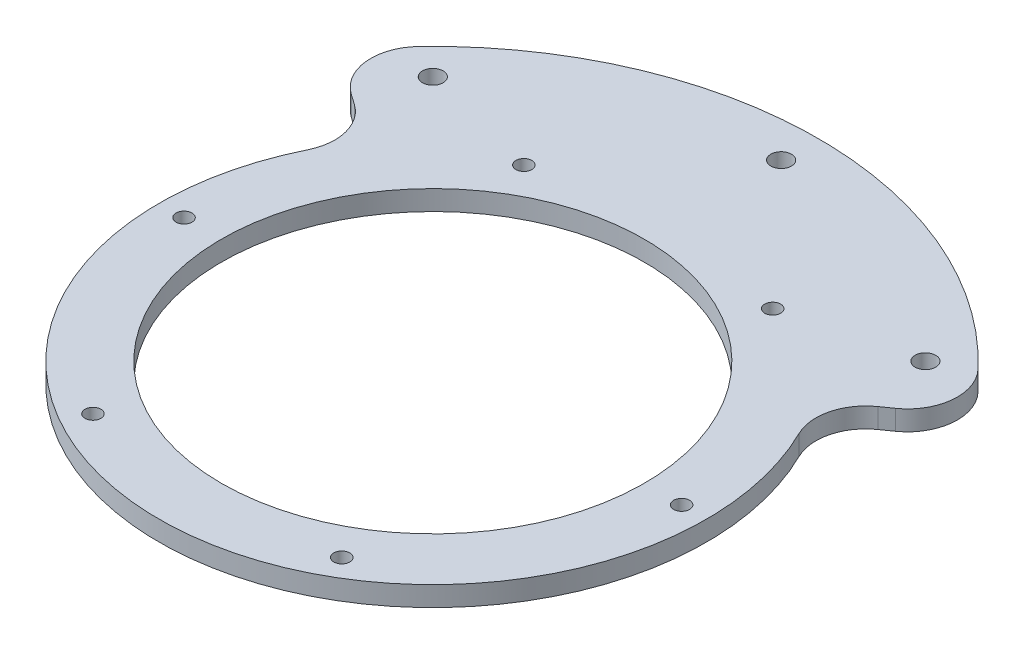
ISO-10303-21;
HEADER;
FILE_DESCRIPTION(('STEP AP214'),'2;1');
FILE_NAME('part.step','',(''),(''),'','','');
FILE_SCHEMA(('AUTOMOTIVE_DESIGN { 1 0 10303 214 1 1 1 1 }'));
ENDSEC;
DATA;
#1=APPLICATION_CONTEXT('core data for automotive mechanical design processes');
#2=APPLICATION_PROTOCOL_DEFINITION('international standard','automotive_design',2000,#1);
#3=PRODUCT_CONTEXT('',#1,'mechanical');
#4=PRODUCT('Part','Part','',(#3));
#5=PRODUCT_RELATED_PRODUCT_CATEGORY('part','',(#4));
#6=PRODUCT_DEFINITION_FORMATION('','',#4);
#7=PRODUCT_DEFINITION_CONTEXT('part definition',#1,'design');
#8=PRODUCT_DEFINITION('design','',#6,#7);
#9=PRODUCT_DEFINITION_SHAPE('','',#8);
#10=(LENGTH_UNIT() NAMED_UNIT(*) SI_UNIT(.MILLI.,.METRE.));
#11=(NAMED_UNIT(*) PLANE_ANGLE_UNIT() SI_UNIT($,.RADIAN.));
#12=(NAMED_UNIT(*) SI_UNIT($,.STERADIAN.) SOLID_ANGLE_UNIT());
#13=UNCERTAINTY_MEASURE_WITH_UNIT(LENGTH_MEASURE(1.E-05),#10,'distance_accuracy_value','');
#14=(GEOMETRIC_REPRESENTATION_CONTEXT(3) GLOBAL_UNCERTAINTY_ASSIGNED_CONTEXT((#13)) GLOBAL_UNIT_ASSIGNED_CONTEXT((#10,
#11,#12)) REPRESENTATION_CONTEXT('',''));
#15=CARTESIAN_POINT('',(0.,0.,0.));
#16=DIRECTION('',(0.,0.,1.));
#17=DIRECTION('',(1.,0.,0.));
#18=AXIS2_PLACEMENT_3D('',#15,#16,#17);
#19=CARTESIAN_POINT('',(0.,4.,0.));
#20=DIRECTION('',(0.,-1.,0.));
#21=DIRECTION('',(0.,0.,-1.));
#22=AXIS2_PLACEMENT_3D('',#19,#20,#21);
#23=CYLINDRICAL_SURFACE('',#22,55.);
#24=CARTESIAN_POINT('',(0.,4.,0.));
#25=DIRECTION('',(0.,1.,0.));
#26=DIRECTION('',(0.,0.,1.));
#27=AXIS2_PLACEMENT_3D('',#24,#25,#26);
#28=CIRCLE('',#27,55.);
#29=CARTESIAN_POINT('',(-49.370332841429,4.,-24.2398480838169));
#30=VERTEX_POINT('',#29);
#31=CARTESIAN_POINT('',(49.370332841429,4.,-24.2398480838169));
#32=VERTEX_POINT('',#31);
#33=EDGE_CURVE('E177',#30,#32,#28,.T.);
#34=ORIENTED_EDGE('',*,*,#33,.F.);
#35=DIRECTION('',(0.,-1.,0.));
#36=VECTOR('',#35,1.);
#37=CARTESIAN_POINT('',(-49.370332841429,4.,-24.2398480838169));
#38=LINE('',#37,#36);
#39=CARTESIAN_POINT('',(-49.370332841429,0.,-24.2398480838169));
#40=VERTEX_POINT('',#39);
#41=EDGE_CURVE('E159',#30,#40,#38,.T.);
#42=ORIENTED_EDGE('',*,*,#41,.T.);
#43=CARTESIAN_POINT('',(0.,0.,0.));
#44=DIRECTION('',(0.,1.,0.));
#45=DIRECTION('',(0.,0.,1.));
#46=AXIS2_PLACEMENT_3D('',#43,#44,#45);
#47=CIRCLE('',#46,55.);
#48=CARTESIAN_POINT('',(49.370332841429,0.,-24.2398480838169));
#49=VERTEX_POINT('',#48);
#50=EDGE_CURVE('E114',#40,#49,#47,.T.);
#51=ORIENTED_EDGE('',*,*,#50,.T.);
#52=DIRECTION('',(0.,-1.,0.));
#53=VECTOR('',#52,1.);
#54=CARTESIAN_POINT('',(49.370332841429,4.,-24.2398480838169));
#55=LINE('',#54,#53);
#56=EDGE_CURVE('E157',#49,#32,#55,.F.);
#57=ORIENTED_EDGE('',*,*,#56,.T.);
#58=EDGE_LOOP('',(#34,#42,#51,#57));
#59=FACE_BOUND('',#58,.T.);
#60=ADVANCED_FACE('F43',(#59),#23,.T.);
#61=CARTESIAN_POINT('',(0.,4.,0.));
#62=DIRECTION('',(-0.573576436351044,0.,-0.819152044288993));
#63=DIRECTION('',(-0.819152044288994,0.,0.573576436351044));
#64=AXIS2_PLACEMENT_3D('',#61,#62,#63);
#65=PLANE('',#64);
#66=DIRECTION('',(0.819152044288994,0.,-0.573576436351044));
#67=VECTOR('',#66,1.);
#68=CARTESIAN_POINT('',(0.,0.,0.));
#69=LINE('',#68,#67);
#70=CARTESIAN_POINT('',(52.6109926309056,0.,-36.8386136328554));
#71=VERTEX_POINT('',#70);
#72=CARTESIAN_POINT('',(54.6826172732023,0.,-38.2891808237325));
#73=VERTEX_POINT('',#72);
#74=EDGE_CURVE('E166',#71,#73,#69,.T.);
#75=ORIENTED_EDGE('',*,*,#74,.T.);
#76=DIRECTION('',(0.,-1.,0.));
#77=VECTOR('',#76,1.);
#78=CARTESIAN_POINT('',(54.6826172732022,4.,-38.2891808237325));
#79=LINE('',#78,#77);
#80=CARTESIAN_POINT('',(54.6826172732023,4.,-38.2891808237325));
#81=VERTEX_POINT('',#80);
#82=EDGE_CURVE('E58',#73,#81,#79,.F.);
#83=ORIENTED_EDGE('',*,*,#82,.T.);
#84=DIRECTION('',(0.819152044288994,0.,-0.573576436351044));
#85=VECTOR('',#84,1.);
#86=CARTESIAN_POINT('',(0.,4.,0.));
#87=LINE('',#86,#85);
#88=CARTESIAN_POINT('',(52.6109926309056,4.,-36.8386136328554));
#89=VERTEX_POINT('',#88);
#90=EDGE_CURVE('E174',#89,#81,#87,.T.);
#91=ORIENTED_EDGE('',*,*,#90,.F.);
#92=DIRECTION('',(0.,1.,0.));
#93=VECTOR('',#92,1.);
#94=CARTESIAN_POINT('',(52.6109926309056,0.,-36.8386136328554));
#95=LINE('',#94,#93);
#96=EDGE_CURVE('E161',#89,#71,#95,.F.);
#97=ORIENTED_EDGE('',*,*,#96,.T.);
#98=EDGE_LOOP('',(#75,#83,#91,#97));
#99=FACE_BOUND('',#98,.T.);
#100=ADVANCED_FACE('F173',(#99),#65,.F.);
#101=CARTESIAN_POINT('',(0.,4.,0.));
#102=DIRECTION('',(0.,-1.,0.));
#103=DIRECTION('',(0.,0.,-1.));
#104=AXIS2_PLACEMENT_3D('',#101,#102,#103);
#105=CYLINDRICAL_SURFACE('',#104,77.5);
#106=CARTESIAN_POINT('',(0.,0.,0.));
#107=DIRECTION('',(0.,1.,0.));
#108=DIRECTION('',(0.,0.,1.));
#109=AXIS2_PLACEMENT_3D('',#106,#107,#108);
#110=CIRCLE('',#109,77.5);
#111=CARTESIAN_POINT('',(56.1982385259425,0.,-53.3667310838998));
#112=VERTEX_POINT('',#111);
#113=CARTESIAN_POINT('',(-56.1982385259425,0.,-53.3667310838998));
#114=VERTEX_POINT('',#113);
#115=EDGE_CURVE('E130',#112,#114,#110,.T.);
#116=ORIENTED_EDGE('',*,*,#115,.T.);
#117=DIRECTION('',(0.,-1.,0.));
#118=VECTOR('',#117,1.);
#119=CARTESIAN_POINT('',(-56.1982385259425,4.,-53.3667310838998));
#120=LINE('',#119,#118);
#121=CARTESIAN_POINT('',(-56.1982385259425,4.,-53.3667310838998));
#122=VERTEX_POINT('',#121);
#123=EDGE_CURVE('E151',#114,#122,#120,.F.);
#124=ORIENTED_EDGE('',*,*,#123,.T.);
#125=CARTESIAN_POINT('',(0.,4.,0.));
#126=DIRECTION('',(0.,1.,0.));
#127=DIRECTION('',(0.,0.,1.));
#128=AXIS2_PLACEMENT_3D('',#125,#126,#127);
#129=CIRCLE('',#128,77.5);
#130=CARTESIAN_POINT('',(56.1982385259425,4.,-53.3667310838998));
#131=VERTEX_POINT('',#130);
#132=EDGE_CURVE('E176',#131,#122,#129,.T.);
#133=ORIENTED_EDGE('',*,*,#132,.F.);
#134=DIRECTION('',(0.,-1.,0.));
#135=VECTOR('',#134,1.);
#136=CARTESIAN_POINT('',(56.1982385259425,4.,-53.3667310838998));
#137=LINE('',#136,#135);
#138=EDGE_CURVE('E148',#131,#112,#137,.T.);
#139=ORIENTED_EDGE('',*,*,#138,.T.);
#140=EDGE_LOOP('',(#116,#124,#133,#139));
#141=FACE_BOUND('',#140,.T.);
#142=ADVANCED_FACE('F263',(#141),#105,.T.);
#143=CARTESIAN_POINT('',(-24.9999999999997,4.,43.3012701892221));
#144=DIRECTION('',(0.,-1.,0.));
#145=DIRECTION('',(0.,0.,-1.));
#146=AXIS2_PLACEMENT_3D('',#143,#144,#145);
#147=CYLINDRICAL_SURFACE('',#146,1.6);
#148=CARTESIAN_POINT('',(-24.9999999999997,4.,43.3012701892221));
#149=DIRECTION('',(0.,1.,0.));
#150=DIRECTION('',(0.,0.,1.));
#151=AXIS2_PLACEMENT_3D('',#148,#149,#150);
#152=CIRCLE('',#151,1.6);
#153=CARTESIAN_POINT('',(-24.9999999999997,4.,44.9012701892221));
#154=VERTEX_POINT('',#153);
#155=EDGE_CURVE('E139',#154,#154,#152,.T.);
#156=ORIENTED_EDGE('',*,*,#155,.T.);
#157=EDGE_LOOP('',(#156));
#158=FACE_BOUND('',#157,.T.);
#159=CARTESIAN_POINT('',(-24.9999999999997,0.,43.3012701892221));
#160=DIRECTION('',(0.,1.,0.));
#161=DIRECTION('',(0.,0.,1.));
#162=AXIS2_PLACEMENT_3D('',#159,#160,#161);
#163=CIRCLE('',#162,1.6);
#164=CARTESIAN_POINT('',(-24.9999999999997,0.,44.9012701892221));
#165=VERTEX_POINT('',#164);
#166=EDGE_CURVE('E236',#165,#165,#163,.T.);
#167=ORIENTED_EDGE('',*,*,#166,.F.);
#168=EDGE_LOOP('',(#167));
#169=FACE_BOUND('',#168,.T.);
#170=ADVANCED_FACE('F286',(#158,#169),#147,.F.);
#171=CARTESIAN_POINT('',(25.0000000000003,4.,43.3012701892218));
#172=DIRECTION('',(0.,-1.,0.));
#173=DIRECTION('',(0.,0.,-1.));
#174=AXIS2_PLACEMENT_3D('',#171,#172,#173);
#175=CYLINDRICAL_SURFACE('',#174,1.6);
#176=CARTESIAN_POINT('',(25.0000000000003,4.,43.3012701892218));
#177=DIRECTION('',(0.,1.,0.));
#178=DIRECTION('',(0.,0.,1.));
#179=AXIS2_PLACEMENT_3D('',#176,#177,#178);
#180=CIRCLE('',#179,1.6);
#181=CARTESIAN_POINT('',(25.0000000000003,4.,44.9012701892218));
#182=VERTEX_POINT('',#181);
#183=EDGE_CURVE('E206',#182,#182,#180,.T.);
#184=ORIENTED_EDGE('',*,*,#183,.T.);
#185=EDGE_LOOP('',(#184));
#186=FACE_BOUND('',#185,.T.);
#187=CARTESIAN_POINT('',(25.0000000000003,0.,43.3012701892218));
#188=DIRECTION('',(0.,1.,0.));
#189=DIRECTION('',(0.,0.,1.));
#190=AXIS2_PLACEMENT_3D('',#187,#188,#189);
#191=CIRCLE('',#190,1.6);
#192=CARTESIAN_POINT('',(25.0000000000003,0.,44.9012701892218));
#193=VERTEX_POINT('',#192);
#194=EDGE_CURVE('E234',#193,#193,#191,.T.);
#195=ORIENTED_EDGE('',*,*,#194,.F.);
#196=EDGE_LOOP('',(#195));
#197=FACE_BOUND('',#196,.T.);
#198=ADVANCED_FACE('F290',(#186,#197),#175,.F.);
#199=CARTESIAN_POINT('',(50.,4.,-3.0845776760901E-13));
#200=DIRECTION('',(0.,-1.,0.));
#201=DIRECTION('',(0.,0.,-1.));
#202=AXIS2_PLACEMENT_3D('',#199,#200,#201);
#203=CYLINDRICAL_SURFACE('',#202,1.6);
#204=CARTESIAN_POINT('',(50.,4.,-3.0845776760901E-13));
#205=DIRECTION('',(0.,1.,0.));
#206=DIRECTION('',(0.,0.,1.));
#207=AXIS2_PLACEMENT_3D('',#204,#205,#206);
#208=CIRCLE('',#207,1.6);
#209=CARTESIAN_POINT('',(50.,4.,1.59999999999969));
#210=VERTEX_POINT('',#209);
#211=EDGE_CURVE('E203',#210,#210,#208,.T.);
#212=ORIENTED_EDGE('',*,*,#211,.T.);
#213=EDGE_LOOP('',(#212));
#214=FACE_BOUND('',#213,.T.);
#215=CARTESIAN_POINT('',(50.,0.,-3.0845776760901E-13));
#216=DIRECTION('',(0.,1.,0.));
#217=DIRECTION('',(0.,0.,1.));
#218=AXIS2_PLACEMENT_3D('',#215,#216,#217);
#219=CIRCLE('',#218,1.6);
#220=CARTESIAN_POINT('',(50.,0.,1.59999999999969));
#221=VERTEX_POINT('',#220);
#222=EDGE_CURVE('E231',#221,#221,#219,.T.);
#223=ORIENTED_EDGE('',*,*,#222,.F.);
#224=EDGE_LOOP('',(#223));
#225=FACE_BOUND('',#224,.T.);
#226=ADVANCED_FACE('F315',(#214,#225),#203,.F.);
#227=CARTESIAN_POINT('',(-25.0000000000003,4.,-43.3012701892218));
#228=DIRECTION('',(0.,-1.,0.));
#229=DIRECTION('',(0.,0.,-1.));
#230=AXIS2_PLACEMENT_3D('',#227,#228,#229);
#231=CYLINDRICAL_SURFACE('',#230,1.60000000000003);
#232=CARTESIAN_POINT('',(-25.0000000000003,4.,-43.3012701892218));
#233=DIRECTION('',(0.,1.,0.));
#234=DIRECTION('',(0.,0.,1.));
#235=AXIS2_PLACEMENT_3D('',#232,#233,#234);
#236=CIRCLE('',#235,1.60000000000003);
#237=CARTESIAN_POINT('',(-25.0000000000003,4.,-41.7012701892217));
#238=VERTEX_POINT('',#237);
#239=EDGE_CURVE('E200',#238,#238,#236,.T.);
#240=ORIENTED_EDGE('',*,*,#239,.T.);
#241=EDGE_LOOP('',(#240));
#242=FACE_BOUND('',#241,.T.);
#243=CARTESIAN_POINT('',(-25.0000000000003,0.,-43.3012701892218));
#244=DIRECTION('',(0.,1.,0.));
#245=DIRECTION('',(0.,0.,1.));
#246=AXIS2_PLACEMENT_3D('',#243,#244,#245);
#247=CIRCLE('',#246,1.60000000000003);
#248=CARTESIAN_POINT('',(-25.0000000000003,0.,-41.7012701892217));
#249=VERTEX_POINT('',#248);
#250=EDGE_CURVE('E228',#249,#249,#247,.T.);
#251=ORIENTED_EDGE('',*,*,#250,.F.);
#252=EDGE_LOOP('',(#251));
#253=FACE_BOUND('',#252,.T.);
#254=ADVANCED_FACE('F311',(#242,#253),#231,.F.);
#255=CARTESIAN_POINT('',(25.,4.,-43.3012701892219));
#256=DIRECTION('',(0.,-1.,0.));
#257=DIRECTION('',(0.,0.,-1.));
#258=AXIS2_PLACEMENT_3D('',#255,#256,#257);
#259=CYLINDRICAL_SURFACE('',#258,1.5999999999998);
#260=CARTESIAN_POINT('',(25.,4.,-43.3012701892219));
#261=DIRECTION('',(0.,1.,0.));
#262=DIRECTION('',(0.,0.,1.));
#263=AXIS2_PLACEMENT_3D('',#260,#261,#262);
#264=CIRCLE('',#263,1.5999999999998);
#265=CARTESIAN_POINT('',(25.,4.,-41.7012701892221));
#266=VERTEX_POINT('',#265);
#267=EDGE_CURVE('E197',#266,#266,#264,.T.);
#268=ORIENTED_EDGE('',*,*,#267,.T.);
#269=EDGE_LOOP('',(#268));
#270=FACE_BOUND('',#269,.T.);
#271=CARTESIAN_POINT('',(25.,0.,-43.3012701892219));
#272=DIRECTION('',(0.,1.,0.));
#273=DIRECTION('',(0.,0.,1.));
#274=AXIS2_PLACEMENT_3D('',#271,#272,#273);
#275=CIRCLE('',#274,1.5999999999998);
#276=CARTESIAN_POINT('',(25.,0.,-41.7012701892221));
#277=VERTEX_POINT('',#276);
#278=EDGE_CURVE('E225',#277,#277,#275,.T.);
#279=ORIENTED_EDGE('',*,*,#278,.F.);
#280=EDGE_LOOP('',(#279));
#281=FACE_BOUND('',#280,.T.);
#282=ADVANCED_FACE('F307',(#270,#281),#259,.F.);
#283=CARTESIAN_POINT('',(0.,4.,0.));
#284=DIRECTION('',(0.,-1.,0.));
#285=DIRECTION('',(0.,0.,-1.));
#286=AXIS2_PLACEMENT_3D('',#283,#284,#285);
#287=CYLINDRICAL_SURFACE('',#286,42.5);
#288=CARTESIAN_POINT('',(0.,4.,0.));
#289=DIRECTION('',(0.,1.,0.));
#290=DIRECTION('',(0.,0.,1.));
#291=AXIS2_PLACEMENT_3D('',#288,#289,#290);
#292=CIRCLE('',#291,42.5);
#293=CARTESIAN_POINT('',(0.,4.,42.5));
#294=VERTEX_POINT('',#293);
#295=EDGE_CURVE('E194',#294,#294,#292,.T.);
#296=ORIENTED_EDGE('',*,*,#295,.T.);
#297=EDGE_LOOP('',(#296));
#298=FACE_BOUND('',#297,.T.);
#299=CARTESIAN_POINT('',(0.,0.,0.));
#300=DIRECTION('',(0.,1.,0.));
#301=DIRECTION('',(0.,0.,1.));
#302=AXIS2_PLACEMENT_3D('',#299,#300,#301);
#303=CIRCLE('',#302,42.5);
#304=CARTESIAN_POINT('',(0.,0.,42.5));
#305=VERTEX_POINT('',#304);
#306=EDGE_CURVE('E222',#305,#305,#303,.T.);
#307=ORIENTED_EDGE('',*,*,#306,.F.);
#308=EDGE_LOOP('',(#307));
#309=FACE_BOUND('',#308,.T.);
#310=ADVANCED_FACE('F303',(#298,#309),#287,.F.);
#311=CARTESIAN_POINT('',(0.,4.,-70.));
#312=DIRECTION('',(0.,-1.,0.));
#313=DIRECTION('',(0.,0.,-1.));
#314=AXIS2_PLACEMENT_3D('',#311,#312,#313);
#315=CYLINDRICAL_SURFACE('',#314,2.07499999999999);
#316=CARTESIAN_POINT('',(0.,4.,-70.));
#317=DIRECTION('',(0.,1.,0.));
#318=DIRECTION('',(0.,0.,1.));
#319=AXIS2_PLACEMENT_3D('',#316,#317,#318);
#320=CIRCLE('',#319,2.07499999999999);
#321=CARTESIAN_POINT('',(0.,4.,-67.925));
#322=VERTEX_POINT('',#321);
#323=EDGE_CURVE('E191',#322,#322,#320,.T.);
#324=ORIENTED_EDGE('',*,*,#323,.T.);
#325=EDGE_LOOP('',(#324));
#326=FACE_BOUND('',#325,.T.);
#327=CARTESIAN_POINT('',(0.,0.,-70.));
#328=DIRECTION('',(0.,1.,0.));
#329=DIRECTION('',(0.,0.,1.));
#330=AXIS2_PLACEMENT_3D('',#327,#328,#329);
#331=CIRCLE('',#330,2.07499999999999);
#332=CARTESIAN_POINT('',(0.,0.,-67.925));
#333=VERTEX_POINT('',#332);
#334=EDGE_CURVE('E219',#333,#333,#331,.T.);
#335=ORIENTED_EDGE('',*,*,#334,.F.);
#336=EDGE_LOOP('',(#335));
#337=FACE_BOUND('',#336,.T.);
#338=ADVANCED_FACE('F299',(#326,#337),#315,.F.);
#339=CARTESIAN_POINT('',(-49.4974746830584,4.,-49.4974746830582));
#340=DIRECTION('',(0.,-1.,0.));
#341=DIRECTION('',(0.,0.,-1.));
#342=AXIS2_PLACEMENT_3D('',#339,#340,#341);
#343=CYLINDRICAL_SURFACE('',#342,2.075);
#344=CARTESIAN_POINT('',(-49.4974746830584,4.,-49.4974746830582));
#345=DIRECTION('',(0.,1.,0.));
#346=DIRECTION('',(0.,0.,1.));
#347=AXIS2_PLACEMENT_3D('',#344,#345,#346);
#348=CIRCLE('',#347,2.075);
#349=CARTESIAN_POINT('',(-49.4974746830584,4.,-47.4224746830582));
#350=VERTEX_POINT('',#349);
#351=EDGE_CURVE('E188',#350,#350,#348,.T.);
#352=ORIENTED_EDGE('',*,*,#351,.T.);
#353=EDGE_LOOP('',(#352));
#354=FACE_BOUND('',#353,.T.);
#355=CARTESIAN_POINT('',(-49.4974746830584,0.,-49.4974746830582));
#356=DIRECTION('',(0.,1.,0.));
#357=DIRECTION('',(0.,0.,1.));
#358=AXIS2_PLACEMENT_3D('',#355,#356,#357);
#359=CIRCLE('',#358,2.075);
#360=CARTESIAN_POINT('',(-49.4974746830584,0.,-47.4224746830582));
#361=VERTEX_POINT('',#360);
#362=EDGE_CURVE('E216',#361,#361,#359,.T.);
#363=ORIENTED_EDGE('',*,*,#362,.F.);
#364=EDGE_LOOP('',(#363));
#365=FACE_BOUND('',#364,.T.);
#366=ADVANCED_FACE('F295',(#354,#365),#343,.F.);
#367=CARTESIAN_POINT('',(49.4974746830584,4.,-49.4974746830582));
#368=DIRECTION('',(0.,-1.,0.));
#369=DIRECTION('',(0.,0.,-1.));
#370=AXIS2_PLACEMENT_3D('',#367,#368,#369);
#371=CYLINDRICAL_SURFACE('',#370,2.075);
#372=CARTESIAN_POINT('',(49.4974746830584,4.,-49.4974746830582));
#373=DIRECTION('',(0.,1.,0.));
#374=DIRECTION('',(0.,0.,1.));
#375=AXIS2_PLACEMENT_3D('',#372,#373,#374);
#376=CIRCLE('',#375,2.075);
#377=CARTESIAN_POINT('',(49.4974746830584,4.,-47.4224746830582));
#378=VERTEX_POINT('',#377);
#379=EDGE_CURVE('E185',#378,#378,#376,.F.);
#380=ORIENTED_EDGE('',*,*,#379,.F.);
#381=EDGE_LOOP('',(#380));
#382=FACE_BOUND('',#381,.T.);
#383=CARTESIAN_POINT('',(49.4974746830584,0.,-49.4974746830582));
#384=DIRECTION('',(0.,1.,0.));
#385=DIRECTION('',(0.,0.,1.));
#386=AXIS2_PLACEMENT_3D('',#383,#384,#385);
#387=CIRCLE('',#386,2.075);
#388=CARTESIAN_POINT('',(49.4974746830584,0.,-47.4224746830582));
#389=VERTEX_POINT('',#388);
#390=EDGE_CURVE('E129',#389,#389,#387,.F.);
#391=ORIENTED_EDGE('',*,*,#390,.T.);
#392=EDGE_LOOP('',(#391));
#393=FACE_BOUND('',#392,.T.);
#394=ADVANCED_FACE('F254',(#382,#393),#371,.F.);
#395=CARTESIAN_POINT('',(0.,4.,0.));
#396=DIRECTION('',(-0.573576436351044,0.,0.819152044288993));
#397=DIRECTION('',(0.819152044288994,0.,0.573576436351044));
#398=AXIS2_PLACEMENT_3D('',#395,#396,#397);
#399=PLANE('',#398);
#400=DIRECTION('',(-0.819152044288994,0.,-0.573576436351044));
#401=VECTOR('',#400,1.);
#402=CARTESIAN_POINT('',(0.,4.,0.));
#403=LINE('',#402,#401);
#404=CARTESIAN_POINT('',(-52.6109926309056,4.,-36.8386136328554));
#405=VERTEX_POINT('',#404);
#406=CARTESIAN_POINT('',(-54.6826172732023,4.,-38.2891808237325));
#407=VERTEX_POINT('',#406);
#408=EDGE_CURVE('E180',#405,#407,#403,.T.);
#409=ORIENTED_EDGE('',*,*,#408,.T.);
#410=DIRECTION('',(0.,1.,0.));
#411=VECTOR('',#410,1.);
#412=CARTESIAN_POINT('',(-54.6826172732023,0.,-38.2891808237325));
#413=LINE('',#412,#411);
#414=CARTESIAN_POINT('',(-54.6826172732023,0.,-38.2891808237325));
#415=VERTEX_POINT('',#414);
#416=EDGE_CURVE('E128',#407,#415,#413,.F.);
#417=ORIENTED_EDGE('',*,*,#416,.T.);
#418=DIRECTION('',(-0.819152044288994,0.,-0.573576436351044));
#419=VECTOR('',#418,1.);
#420=CARTESIAN_POINT('',(0.,0.,0.));
#421=LINE('',#420,#419);
#422=CARTESIAN_POINT('',(-52.6109926309056,0.,-36.8386136328554));
#423=VERTEX_POINT('',#422);
#424=EDGE_CURVE('E112',#423,#415,#421,.T.);
#425=ORIENTED_EDGE('',*,*,#424,.F.);
#426=DIRECTION('',(0.,-1.,0.));
#427=VECTOR('',#426,1.);
#428=CARTESIAN_POINT('',(-52.6109926309056,4.,-36.8386136328554));
#429=LINE('',#428,#427);
#430=EDGE_CURVE('E125',#423,#405,#429,.F.);
#431=ORIENTED_EDGE('',*,*,#430,.T.);
#432=EDGE_LOOP('',(#409,#417,#425,#431));
#433=FACE_BOUND('',#432,.T.);
#434=ADVANCED_FACE('F124',(#433),#399,.T.);
#435=CARTESIAN_POINT('',(-50.,4.,0.));
#436=DIRECTION('',(0.,-1.,0.));
#437=DIRECTION('',(0.,0.,-1.));
#438=AXIS2_PLACEMENT_3D('',#435,#436,#437);
#439=CYLINDRICAL_SURFACE('',#438,1.59999999999991);
#440=CARTESIAN_POINT('',(-50.,4.,0.));
#441=DIRECTION('',(0.,1.,0.));
#442=DIRECTION('',(0.,0.,1.));
#443=AXIS2_PLACEMENT_3D('',#440,#441,#442);
#444=CIRCLE('',#443,1.59999999999991);
#445=CARTESIAN_POINT('',(-50.,4.,1.59999999999993));
#446=VERTEX_POINT('',#445);
#447=EDGE_CURVE('E134',#446,#446,#444,.T.);
#448=ORIENTED_EDGE('',*,*,#447,.T.);
#449=EDGE_LOOP('',(#448));
#450=FACE_BOUND('',#449,.T.);
#451=CARTESIAN_POINT('',(-50.,0.,0.));
#452=DIRECTION('',(0.,1.,0.));
#453=DIRECTION('',(0.,0.,1.));
#454=AXIS2_PLACEMENT_3D('',#451,#452,#453);
#455=CIRCLE('',#454,1.59999999999991);
#456=CARTESIAN_POINT('',(-50.,0.,1.59999999999993));
#457=VERTEX_POINT('',#456);
#458=EDGE_CURVE('E142',#457,#457,#455,.T.);
#459=ORIENTED_EDGE('',*,*,#458,.F.);
#460=EDGE_LOOP('',(#459));
#461=FACE_BOUND('',#460,.T.);
#462=ADVANCED_FACE('F244',(#450,#461),#439,.F.);
#463=CARTESIAN_POINT('',(0.,4.,0.));
#464=DIRECTION('',(0.,1.,0.));
#465=DIRECTION('',(0.,0.,1.));
#466=AXIS2_PLACEMENT_3D('',#463,#464,#465);
#467=PLANE('',#466);
#468=ORIENTED_EDGE('',*,*,#132,.T.);
#469=CARTESIAN_POINT('',(-48.9468529096918,4.,-46.4807012666224));
#470=DIRECTION('',(0.,1.,0.));
#471=DIRECTION('',(0.,0.,1.));
#472=AXIS2_PLACEMENT_3D('',#469,#470,#471);
#473=CIRCLE('',#472,10.);
#474=EDGE_CURVE('E155',#122,#407,#473,.T.);
#475=ORIENTED_EDGE('',*,*,#474,.T.);
#476=ORIENTED_EDGE('',*,*,#408,.F.);
#477=CARTESIAN_POINT('',(-58.346756994416,4.,-28.6470931899654));
#478=DIRECTION('',(0.,1.,0.));
#479=DIRECTION('',(0.,0.,1.));
#480=AXIS2_PLACEMENT_3D('',#477,#478,#479);
#481=CIRCLE('',#480,10.);
#482=EDGE_CURVE('E119',#405,#30,#481,.F.);
#483=ORIENTED_EDGE('',*,*,#482,.T.);
#484=ORIENTED_EDGE('',*,*,#33,.T.);
#485=CARTESIAN_POINT('',(58.346756994416,4.,-28.6470931899654));
#486=DIRECTION('',(0.,1.,0.));
#487=DIRECTION('',(0.,0.,1.));
#488=AXIS2_PLACEMENT_3D('',#485,#486,#487);
#489=CIRCLE('',#488,10.);
#490=EDGE_CURVE('E11',#32,#89,#489,.F.);
#491=ORIENTED_EDGE('',*,*,#490,.T.);
#492=ORIENTED_EDGE('',*,*,#90,.T.);
#493=CARTESIAN_POINT('',(48.9468529096918,4.,-46.4807012666224));
#494=DIRECTION('',(0.,1.,0.));
#495=DIRECTION('',(0.,0.,1.));
#496=AXIS2_PLACEMENT_3D('',#493,#494,#495);
#497=CIRCLE('',#496,10.);
#498=EDGE_CURVE('E153',#81,#131,#497,.T.);
#499=ORIENTED_EDGE('',*,*,#498,.T.);
#500=EDGE_LOOP('',(#468,#475,#476,#483,#484,#491,#492,#499));
#501=FACE_BOUND('',#500,.T.);
#502=ORIENTED_EDGE('',*,*,#379,.T.);
#503=EDGE_LOOP('',(#502));
#504=FACE_BOUND('',#503,.T.);
#505=ORIENTED_EDGE('',*,*,#351,.F.);
#506=EDGE_LOOP('',(#505));
#507=FACE_BOUND('',#506,.T.);
#508=ORIENTED_EDGE('',*,*,#323,.F.);
#509=EDGE_LOOP('',(#508));
#510=FACE_BOUND('',#509,.T.);
#511=ORIENTED_EDGE('',*,*,#295,.F.);
#512=EDGE_LOOP('',(#511));
#513=FACE_BOUND('',#512,.T.);
#514=ORIENTED_EDGE('',*,*,#267,.F.);
#515=EDGE_LOOP('',(#514));
#516=FACE_BOUND('',#515,.T.);
#517=ORIENTED_EDGE('',*,*,#239,.F.);
#518=EDGE_LOOP('',(#517));
#519=FACE_BOUND('',#518,.T.);
#520=ORIENTED_EDGE('',*,*,#211,.F.);
#521=EDGE_LOOP('',(#520));
#522=FACE_BOUND('',#521,.T.);
#523=ORIENTED_EDGE('',*,*,#183,.F.);
#524=EDGE_LOOP('',(#523));
#525=FACE_BOUND('',#524,.T.);
#526=ORIENTED_EDGE('',*,*,#155,.F.);
#527=EDGE_LOOP('',(#526));
#528=FACE_BOUND('',#527,.T.);
#529=ORIENTED_EDGE('',*,*,#447,.F.);
#530=EDGE_LOOP('',(#529));
#531=FACE_BOUND('',#530,.T.);
#532=ADVANCED_FACE('F246',(#501,#504,#507,#510,#513,#516,#519,#522,#525,#528,#531),#467,.T.);
#533=CARTESIAN_POINT('',(0.,0.,0.));
#534=DIRECTION('',(0.,1.,0.));
#535=DIRECTION('',(0.,0.,1.));
#536=AXIS2_PLACEMENT_3D('',#533,#534,#535);
#537=PLANE('',#536);
#538=ORIENTED_EDGE('',*,*,#424,.T.);
#539=CARTESIAN_POINT('',(-48.9468529096918,0.,-46.4807012666224));
#540=DIRECTION('',(0.,1.,0.));
#541=DIRECTION('',(0.,0.,1.));
#542=AXIS2_PLACEMENT_3D('',#539,#540,#541);
#543=CIRCLE('',#542,10.);
#544=EDGE_CURVE('E146',#415,#114,#543,.F.);
#545=ORIENTED_EDGE('',*,*,#544,.T.);
#546=ORIENTED_EDGE('',*,*,#115,.F.);
#547=CARTESIAN_POINT('',(48.9468529096918,0.,-46.4807012666224));
#548=DIRECTION('',(0.,1.,0.));
#549=DIRECTION('',(0.,0.,1.));
#550=AXIS2_PLACEMENT_3D('',#547,#548,#549);
#551=CIRCLE('',#550,10.);
#552=EDGE_CURVE('E136',#112,#73,#551,.F.);
#553=ORIENTED_EDGE('',*,*,#552,.T.);
#554=ORIENTED_EDGE('',*,*,#74,.F.);
#555=CARTESIAN_POINT('',(58.346756994416,0.,-28.6470931899654));
#556=DIRECTION('',(0.,1.,0.));
#557=DIRECTION('',(0.,0.,1.));
#558=AXIS2_PLACEMENT_3D('',#555,#556,#557);
#559=CIRCLE('',#558,10.);
#560=EDGE_CURVE('E51',#71,#49,#559,.T.);
#561=ORIENTED_EDGE('',*,*,#560,.T.);
#562=ORIENTED_EDGE('',*,*,#50,.F.);
#563=CARTESIAN_POINT('',(-58.346756994416,0.,-28.6470931899654));
#564=DIRECTION('',(0.,1.,0.));
#565=DIRECTION('',(0.,0.,1.));
#566=AXIS2_PLACEMENT_3D('',#563,#564,#565);
#567=CIRCLE('',#566,10.);
#568=EDGE_CURVE('E108',#40,#423,#567,.T.);
#569=ORIENTED_EDGE('',*,*,#568,.T.);
#570=EDGE_LOOP('',(#538,#545,#546,#553,#554,#561,#562,#569));
#571=FACE_BOUND('',#570,.T.);
#572=ORIENTED_EDGE('',*,*,#390,.F.);
#573=EDGE_LOOP('',(#572));
#574=FACE_BOUND('',#573,.T.);
#575=ORIENTED_EDGE('',*,*,#362,.T.);
#576=EDGE_LOOP('',(#575));
#577=FACE_BOUND('',#576,.T.);
#578=ORIENTED_EDGE('',*,*,#334,.T.);
#579=EDGE_LOOP('',(#578));
#580=FACE_BOUND('',#579,.T.);
#581=ORIENTED_EDGE('',*,*,#306,.T.);
#582=EDGE_LOOP('',(#581));
#583=FACE_BOUND('',#582,.T.);
#584=ORIENTED_EDGE('',*,*,#278,.T.);
#585=EDGE_LOOP('',(#584));
#586=FACE_BOUND('',#585,.T.);
#587=ORIENTED_EDGE('',*,*,#250,.T.);
#588=EDGE_LOOP('',(#587));
#589=FACE_BOUND('',#588,.T.);
#590=ORIENTED_EDGE('',*,*,#222,.T.);
#591=EDGE_LOOP('',(#590));
#592=FACE_BOUND('',#591,.T.);
#593=ORIENTED_EDGE('',*,*,#194,.T.);
#594=EDGE_LOOP('',(#593));
#595=FACE_BOUND('',#594,.T.);
#596=ORIENTED_EDGE('',*,*,#166,.T.);
#597=EDGE_LOOP('',(#596));
#598=FACE_BOUND('',#597,.T.);
#599=ORIENTED_EDGE('',*,*,#458,.T.);
#600=EDGE_LOOP('',(#599));
#601=FACE_BOUND('',#600,.T.);
#602=ADVANCED_FACE('F110',(#571,#574,#577,#580,#583,#586,#589,#592,#595,#598,#601),#537,.F.);
#603=CARTESIAN_POINT('',(-48.9468529096918,4.,-46.4807012666224));
#604=DIRECTION('',(0.,-1.,0.));
#605=DIRECTION('',(0.,0.,-1.));
#606=AXIS2_PLACEMENT_3D('',#603,#604,#605);
#607=CYLINDRICAL_SURFACE('',#606,10.);
#608=ORIENTED_EDGE('',*,*,#474,.F.);
#609=ORIENTED_EDGE('',*,*,#123,.F.);
#610=ORIENTED_EDGE('',*,*,#544,.F.);
#611=ORIENTED_EDGE('',*,*,#416,.F.);
#612=EDGE_LOOP('',(#608,#609,#610,#611));
#613=FACE_BOUND('',#612,.T.);
#614=ADVANCED_FACE('F267',(#613),#607,.T.);
#615=CARTESIAN_POINT('',(-58.346756994416,4.,-28.6470931899654));
#616=DIRECTION('',(0.,-1.,0.));
#617=DIRECTION('',(0.,0.,-1.));
#618=AXIS2_PLACEMENT_3D('',#615,#616,#617);
#619=CYLINDRICAL_SURFACE('',#618,10.);
#620=ORIENTED_EDGE('',*,*,#482,.F.);
#621=ORIENTED_EDGE('',*,*,#430,.F.);
#622=ORIENTED_EDGE('',*,*,#568,.F.);
#623=ORIENTED_EDGE('',*,*,#41,.F.);
#624=EDGE_LOOP('',(#620,#621,#622,#623));
#625=FACE_BOUND('',#624,.T.);
#626=ADVANCED_FACE('F133',(#625),#619,.F.);
#627=CARTESIAN_POINT('',(48.9468529096918,4.,-46.4807012666224));
#628=DIRECTION('',(0.,-1.,0.));
#629=DIRECTION('',(0.,0.,-1.));
#630=AXIS2_PLACEMENT_3D('',#627,#628,#629);
#631=CYLINDRICAL_SURFACE('',#630,10.);
#632=ORIENTED_EDGE('',*,*,#498,.F.);
#633=ORIENTED_EDGE('',*,*,#82,.F.);
#634=ORIENTED_EDGE('',*,*,#552,.F.);
#635=ORIENTED_EDGE('',*,*,#138,.F.);
#636=EDGE_LOOP('',(#632,#633,#634,#635));
#637=FACE_BOUND('',#636,.T.);
#638=ADVANCED_FACE('F272',(#637),#631,.T.);
#639=CARTESIAN_POINT('',(58.346756994416,4.,-28.6470931899654));
#640=DIRECTION('',(0.,-1.,0.));
#641=DIRECTION('',(0.,0.,-1.));
#642=AXIS2_PLACEMENT_3D('',#639,#640,#641);
#643=CYLINDRICAL_SURFACE('',#642,10.);
#644=ORIENTED_EDGE('',*,*,#490,.F.);
#645=ORIENTED_EDGE('',*,*,#56,.F.);
#646=ORIENTED_EDGE('',*,*,#560,.F.);
#647=ORIENTED_EDGE('',*,*,#96,.F.);
#648=EDGE_LOOP('',(#644,#645,#646,#647));
#649=FACE_BOUND('',#648,.T.);
#650=ADVANCED_FACE('F45',(#649),#643,.F.);
#651=CLOSED_SHELL('',(#60,#100,#142,#170,#198,#226,#254,#282,#310,#338,#366,#394,#434,#462,#532,
#602,#614,#626,#638,#650));
#652=MANIFOLD_SOLID_BREP('B2',#651);
#653=ADVANCED_BREP_SHAPE_REPRESENTATION('',(#18,#652),#14);
#654=SHAPE_DEFINITION_REPRESENTATION(#9,#653);
ENDSEC;
END-ISO-10303-21;
